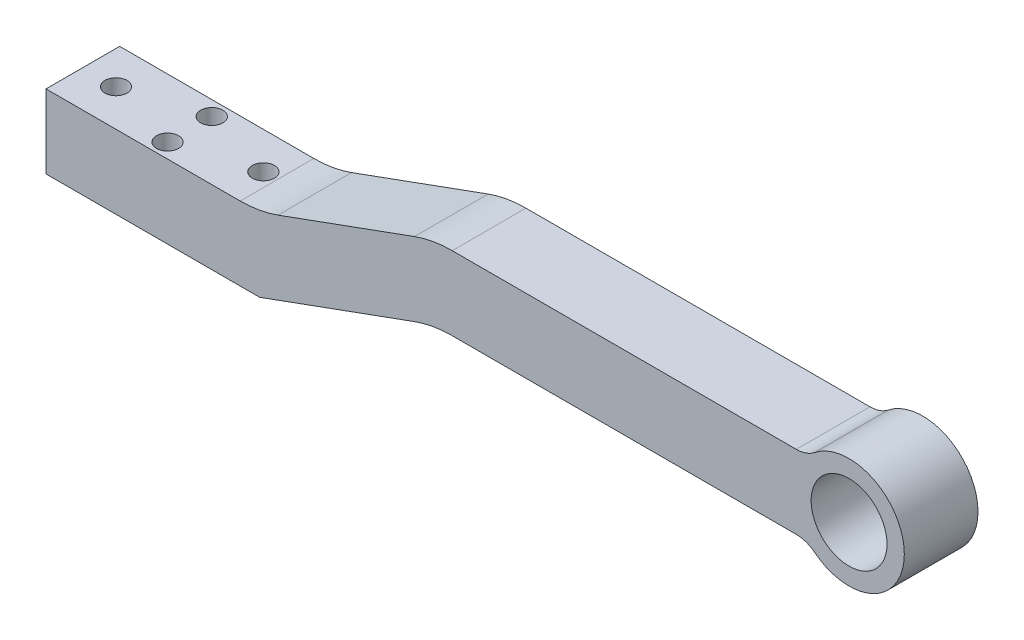
ISO-10303-21;
HEADER;
FILE_DESCRIPTION(('STEP AP214'),'2;1');
FILE_NAME('part.step','',(''),(''),'','','');
FILE_SCHEMA(('AUTOMOTIVE_DESIGN { 1 0 10303 214 1 1 1 1 }'));
ENDSEC;
DATA;
#1=APPLICATION_CONTEXT('core data for automotive mechanical design processes');
#2=APPLICATION_PROTOCOL_DEFINITION('international standard','automotive_design',2000,#1);
#3=PRODUCT_CONTEXT('',#1,'mechanical');
#4=PRODUCT('Part','Part','',(#3));
#5=PRODUCT_RELATED_PRODUCT_CATEGORY('part','',(#4));
#6=PRODUCT_DEFINITION_FORMATION('','',#4);
#7=PRODUCT_DEFINITION_CONTEXT('part definition',#1,'design');
#8=PRODUCT_DEFINITION('design','',#6,#7);
#9=PRODUCT_DEFINITION_SHAPE('','',#8);
#10=(LENGTH_UNIT() NAMED_UNIT(*) SI_UNIT(.MILLI.,.METRE.));
#11=(NAMED_UNIT(*) PLANE_ANGLE_UNIT() SI_UNIT($,.RADIAN.));
#12=(NAMED_UNIT(*) SI_UNIT($,.STERADIAN.) SOLID_ANGLE_UNIT());
#13=UNCERTAINTY_MEASURE_WITH_UNIT(LENGTH_MEASURE(1.E-05),#10,'distance_accuracy_value','');
#14=(GEOMETRIC_REPRESENTATION_CONTEXT(3) GLOBAL_UNCERTAINTY_ASSIGNED_CONTEXT((#13)) GLOBAL_UNIT_ASSIGNED_CONTEXT((#10,
#11,#12)) REPRESENTATION_CONTEXT('',''));
#15=CARTESIAN_POINT('',(0.,0.,0.));
#16=DIRECTION('',(0.,0.,1.));
#17=DIRECTION('',(1.,0.,0.));
#18=AXIS2_PLACEMENT_3D('',#15,#16,#17);
#19=CARTESIAN_POINT('',(154.228900421622,233.510087452104,4.));
#20=DIRECTION('',(0.,-1.,0.));
#21=DIRECTION('',(1.,0.,0.));
#22=AXIS2_PLACEMENT_3D('',#19,#20,#21);
#23=CYLINDRICAL_SURFACE('',#22,1.60000000000002);
#24=CARTESIAN_POINT('',(154.228900421622,213.510087452104,4.));
#25=DIRECTION('',(0.,-1.,0.));
#26=DIRECTION('',(1.,0.,0.));
#27=AXIS2_PLACEMENT_3D('',#24,#25,#26);
#28=CIRCLE('',#27,1.60000000000002);
#29=CARTESIAN_POINT('',(155.828900421622,213.510087452104,4.));
#30=VERTEX_POINT('',#29);
#31=EDGE_CURVE('E220',#30,#30,#28,.T.);
#32=ORIENTED_EDGE('',*,*,#31,.T.);
#33=EDGE_LOOP('',(#32));
#34=FACE_BOUND('',#33,.T.);
#35=CARTESIAN_POINT('',(154.228900421622,225.010087452104,4.));
#36=DIRECTION('',(0.,1.,0.));
#37=DIRECTION('',(0.,0.,1.));
#38=AXIS2_PLACEMENT_3D('',#35,#36,#37);
#39=CIRCLE('',#38,1.60000000000002);
#40=CARTESIAN_POINT('',(154.228900421622,225.010087452104,5.60000000000002));
#41=VERTEX_POINT('',#40);
#42=EDGE_CURVE('E39',#41,#41,#39,.F.);
#43=ORIENTED_EDGE('',*,*,#42,.F.);
#44=EDGE_LOOP('',(#43));
#45=FACE_BOUND('',#44,.T.);
#46=ADVANCED_FACE('F35',(#34,#45),#23,.F.);
#47=CARTESIAN_POINT('',(154.228900421622,233.510087452104,16.));
#48=DIRECTION('',(0.,-1.,0.));
#49=DIRECTION('',(1.,0.,0.));
#50=AXIS2_PLACEMENT_3D('',#47,#48,#49);
#51=CYLINDRICAL_SURFACE('',#50,1.59999999999999);
#52=CARTESIAN_POINT('',(154.228900421622,213.510087452104,16.));
#53=DIRECTION('',(0.,-1.,0.));
#54=DIRECTION('',(1.,0.,0.));
#55=AXIS2_PLACEMENT_3D('',#52,#53,#54);
#56=CIRCLE('',#55,1.59999999999999);
#57=CARTESIAN_POINT('',(155.828900421622,213.510087452104,16.));
#58=VERTEX_POINT('',#57);
#59=EDGE_CURVE('E245',#58,#58,#56,.T.);
#60=ORIENTED_EDGE('',*,*,#59,.T.);
#61=EDGE_LOOP('',(#60));
#62=FACE_BOUND('',#61,.T.);
#63=CARTESIAN_POINT('',(154.228900421622,225.010087452104,16.));
#64=DIRECTION('',(0.,1.,0.));
#65=DIRECTION('',(0.,0.,1.));
#66=AXIS2_PLACEMENT_3D('',#63,#64,#65);
#67=CIRCLE('',#66,1.59999999999999);
#68=CARTESIAN_POINT('',(154.228900421622,225.010087452104,17.6));
#69=VERTEX_POINT('',#68);
#70=EDGE_CURVE('E224',#69,#69,#67,.F.);
#71=ORIENTED_EDGE('',*,*,#70,.F.);
#72=EDGE_LOOP('',(#71));
#73=FACE_BOUND('',#72,.T.);
#74=ADVANCED_FACE('F304',(#62,#73),#51,.F.);
#75=CARTESIAN_POINT('',(174.228900421622,233.510087452104,10.));
#76=DIRECTION('',(0.,-1.,0.));
#77=DIRECTION('',(1.,0.,0.));
#78=AXIS2_PLACEMENT_3D('',#75,#76,#77);
#79=CYLINDRICAL_SURFACE('',#78,1.59999999999999);
#80=CARTESIAN_POINT('',(174.228900421622,213.510087452104,10.));
#81=DIRECTION('',(0.,-1.,0.));
#82=DIRECTION('',(1.,0.,0.));
#83=AXIS2_PLACEMENT_3D('',#80,#81,#82);
#84=CIRCLE('',#83,1.59999999999999);
#85=CARTESIAN_POINT('',(175.828900421622,213.510087452104,10.));
#86=VERTEX_POINT('',#85);
#87=EDGE_CURVE('E241',#86,#86,#84,.T.);
#88=ORIENTED_EDGE('',*,*,#87,.T.);
#89=EDGE_LOOP('',(#88));
#90=FACE_BOUND('',#89,.T.);
#91=CARTESIAN_POINT('',(174.228900421622,225.010087452104,10.));
#92=DIRECTION('',(0.,1.,0.));
#93=DIRECTION('',(0.,0.,1.));
#94=AXIS2_PLACEMENT_3D('',#91,#92,#93);
#95=CIRCLE('',#94,1.59999999999999);
#96=CARTESIAN_POINT('',(174.228900421622,225.010087452104,11.6));
#97=VERTEX_POINT('',#96);
#98=EDGE_CURVE('E222',#97,#97,#95,.F.);
#99=ORIENTED_EDGE('',*,*,#98,.F.);
#100=EDGE_LOOP('',(#99));
#101=FACE_BOUND('',#100,.T.);
#102=ADVANCED_FACE('F310',(#90,#101),#79,.F.);
#103=CARTESIAN_POINT('',(134.228900421622,233.510087452104,10.));
#104=DIRECTION('',(0.,-1.,0.));
#105=DIRECTION('',(1.,0.,0.));
#106=AXIS2_PLACEMENT_3D('',#103,#104,#105);
#107=CYLINDRICAL_SURFACE('',#106,1.59999999999999);
#108=CARTESIAN_POINT('',(134.228900421622,213.510087452104,10.));
#109=DIRECTION('',(0.,-1.,0.));
#110=DIRECTION('',(1.,0.,0.));
#111=AXIS2_PLACEMENT_3D('',#108,#109,#110);
#112=CIRCLE('',#111,1.59999999999999);
#113=CARTESIAN_POINT('',(135.828900421622,213.510087452104,10.));
#114=VERTEX_POINT('',#113);
#115=EDGE_CURVE('E244',#114,#114,#112,.T.);
#116=ORIENTED_EDGE('',*,*,#115,.T.);
#117=EDGE_LOOP('',(#116));
#118=FACE_BOUND('',#117,.T.);
#119=CARTESIAN_POINT('',(134.228900421622,225.010087452104,10.));
#120=DIRECTION('',(0.,1.,0.));
#121=DIRECTION('',(0.,0.,1.));
#122=AXIS2_PLACEMENT_3D('',#119,#120,#121);
#123=CIRCLE('',#122,1.59999999999999);
#124=CARTESIAN_POINT('',(134.228900421622,225.010087452104,11.6));
#125=VERTEX_POINT('',#124);
#126=EDGE_CURVE('E217',#125,#125,#123,.F.);
#127=ORIENTED_EDGE('',*,*,#126,.F.);
#128=EDGE_LOOP('',(#127));
#129=FACE_BOUND('',#128,.T.);
#130=ADVANCED_FACE('F316',(#118,#129),#107,.F.);
#131=CARTESIAN_POINT('',(328.909813265947,222.611094618387,20.));
#132=DIRECTION('',(0.,0.,1.));
#133=DIRECTION('',(1.,0.,0.));
#134=AXIS2_PLACEMENT_3D('',#131,#132,#133);
#135=PLANE('',#134);
#136=CARTESIAN_POINT('',(328.909813265947,222.611094618387,20.));
#137=DIRECTION('',(0.,0.,-1.));
#138=DIRECTION('',(1.,0.,0.));
#139=AXIS2_PLACEMENT_3D('',#136,#137,#138);
#140=CIRCLE('',#139,8.00000000000002);
#141=CARTESIAN_POINT('',(328.909813265947,230.611094618387,20.));
#142=VERTEX_POINT('',#141);
#143=CARTESIAN_POINT('',(333.890365320094,228.871613864897,20.));
#144=VERTEX_POINT('',#143);
#145=EDGE_CURVE('E190',#142,#144,#140,.T.);
#146=ORIENTED_EDGE('',*,*,#145,.T.);
#147=CARTESIAN_POINT('',(343.228900421622,240.610087452104,20.));
#148=DIRECTION('',(0.,0.,1.));
#149=DIRECTION('',(1.,0.,0.));
#150=AXIS2_PLACEMENT_3D('',#147,#148,#149);
#151=CIRCLE('',#150,15.);
#152=CARTESIAN_POINT('',(333.891295648932,252.349301101622,20.));
#153=VERTEX_POINT('',#152);
#154=EDGE_CURVE('E112',#144,#153,#151,.T.);
#155=ORIENTED_EDGE('',*,*,#154,.T.);
#156=CARTESIAN_POINT('',(328.911239770165,258.610215048032,20.));
#157=DIRECTION('',(0.,0.,-1.));
#158=DIRECTION('',(1.,0.,0.));
#159=AXIS2_PLACEMENT_3D('',#156,#157,#158);
#160=CIRCLE('',#159,7.99999999999999);
#161=CARTESIAN_POINT('',(328.911168476054,250.61021504835,20.));
#162=VERTEX_POINT('',#161);
#163=EDGE_CURVE('E259',#153,#162,#160,.T.);
#164=ORIENTED_EDGE('',*,*,#163,.T.);
#165=DIRECTION('',(-0.99999999996029,8.91176388371409E-06,0.));
#166=VECTOR('',#165,1.);
#167=CARTESIAN_POINT('',(235.50347871469,250.611047475626,20.));
#168=LINE('',#167,#166);
#169=CARTESIAN_POINT('',(235.50347871469,250.611047475626,20.));
#170=VERTEX_POINT('',#169);
#171=EDGE_CURVE('E261',#162,#170,#168,.T.);
#172=ORIENTED_EDGE('',*,*,#171,.T.);
#173=CARTESIAN_POINT('',(235.503211361773,220.611047476817,20.));
#174=DIRECTION('',(0.,0.,1.));
#175=DIRECTION('',(1.,0.,0.));
#176=AXIS2_PLACEMENT_3D('',#173,#174,#175);
#177=CIRCLE('',#176,30.);
#178=CARTESIAN_POINT('',(225.242607062003,248.801826100395,20.));
#179=VERTEX_POINT('',#178);
#180=EDGE_CURVE('E263',#170,#179,#177,.T.);
#181=ORIENTED_EDGE('',*,*,#180,.T.);
#182=DIRECTION('',(-0.939692620785908,-0.342020143325669,0.));
#183=VECTOR('',#182,1.);
#184=CARTESIAN_POINT('',(188.199695300138,235.319308828526,20.));
#185=LINE('',#184,#183);
#186=CARTESIAN_POINT('',(188.199695300138,235.319308828526,20.));
#187=VERTEX_POINT('',#186);
#188=EDGE_CURVE('E265',#179,#187,#185,.T.);
#189=ORIENTED_EDGE('',*,*,#188,.T.);
#190=CARTESIAN_POINT('',(177.939091000368,263.510087452104,20.));
#191=DIRECTION('',(0.,0.,-1.));
#192=DIRECTION('',(1.,0.,0.));
#193=AXIS2_PLACEMENT_3D('',#190,#191,#192);
#194=CIRCLE('',#193,30.);
#195=CARTESIAN_POINT('',(177.939091000368,233.510087452104,20.));
#196=VERTEX_POINT('',#195);
#197=EDGE_CURVE('E267',#187,#196,#194,.T.);
#198=ORIENTED_EDGE('',*,*,#197,.T.);
#199=DIRECTION('',(-1.,0.,0.));
#200=VECTOR('',#199,1.);
#201=CARTESIAN_POINT('',(125.228900421622,233.510087452104,20.));
#202=LINE('',#201,#200);
#203=CARTESIAN_POINT('',(125.228900421622,233.510087452104,20.));
#204=VERTEX_POINT('',#203);
#205=EDGE_CURVE('E269',#196,#204,#202,.T.);
#206=ORIENTED_EDGE('',*,*,#205,.T.);
#207=DIRECTION('',(0.,-1.,0.));
#208=VECTOR('',#207,1.);
#209=CARTESIAN_POINT('',(125.228900421622,233.510087452104,20.));
#210=LINE('',#209,#208);
#211=CARTESIAN_POINT('',(125.228900421622,213.510087452104,20.));
#212=VERTEX_POINT('',#211);
#213=EDGE_CURVE('E271',#204,#212,#210,.T.);
#214=ORIENTED_EDGE('',*,*,#213,.T.);
#215=DIRECTION('',(1.,0.,0.));
#216=VECTOR('',#215,1.);
#217=CARTESIAN_POINT('',(125.228900421622,213.510087452104,20.));
#218=LINE('',#217,#216);
#219=CARTESIAN_POINT('',(183.228900421622,213.510087452104,20.));
#220=VERTEX_POINT('',#219);
#221=EDGE_CURVE('E147',#212,#220,#218,.T.);
#222=ORIENTED_EDGE('',*,*,#221,.T.);
#223=DIRECTION('',(0.939692620785909,0.342020143325669,0.));
#224=VECTOR('',#223,1.);
#225=CARTESIAN_POINT('',(183.228900421622,213.510087452104,20.));
#226=LINE('',#225,#224);
#227=CARTESIAN_POINT('',(225.242736582401,228.801873241964,20.));
#228=VERTEX_POINT('',#227);
#229=EDGE_CURVE('E140',#220,#228,#226,.T.);
#230=ORIENTED_EDGE('',*,*,#229,.T.);
#231=CARTESIAN_POINT('',(235.503340882171,200.611094618387,20.));
#232=DIRECTION('',(0.,0.,-1.));
#233=DIRECTION('',(1.,0.,0.));
#234=AXIS2_PLACEMENT_3D('',#231,#232,#233);
#235=CIRCLE('',#234,30.);
#236=CARTESIAN_POINT('',(235.503340882171,230.611094618387,20.));
#237=VERTEX_POINT('',#236);
#238=EDGE_CURVE('E145',#228,#237,#235,.T.);
#239=ORIENTED_EDGE('',*,*,#238,.T.);
#240=DIRECTION('',(1.,0.,0.));
#241=VECTOR('',#240,1.);
#242=CARTESIAN_POINT('',(235.503340882171,230.611094618387,20.));
#243=LINE('',#242,#241);
#244=EDGE_CURVE('E54',#237,#142,#243,.T.);
#245=ORIENTED_EDGE('',*,*,#244,.T.);
#246=EDGE_LOOP('',(#146,#155,#164,#172,#181,#189,#198,#206,#214,#222,#230,#239,#245));
#247=FACE_BOUND('',#246,.T.);
#248=CARTESIAN_POINT('',(343.228900421622,240.610087452104,20.));
#249=DIRECTION('',(0.,0.,1.));
#250=DIRECTION('',(1.,0.,0.));
#251=AXIS2_PLACEMENT_3D('',#248,#249,#250);
#252=CIRCLE('',#251,10.3);
#253=CARTESIAN_POINT('',(353.528900421622,240.610087452104,20.));
#254=VERTEX_POINT('',#253);
#255=EDGE_CURVE('E169',#254,#254,#252,.T.);
#256=ORIENTED_EDGE('',*,*,#255,.F.);
#257=EDGE_LOOP('',(#256));
#258=FACE_BOUND('',#257,.T.);
#259=ADVANCED_FACE('F142',(#247,#258),#135,.T.);
#260=CARTESIAN_POINT('',(328.909813265947,222.611094618387,0.));
#261=DIRECTION('',(0.,0.,1.));
#262=DIRECTION('',(1.,0.,0.));
#263=AXIS2_PLACEMENT_3D('',#260,#261,#262);
#264=PLANE('',#263);
#265=CARTESIAN_POINT('',(328.909813265947,222.611094618387,0.));
#266=DIRECTION('',(0.,0.,-1.));
#267=DIRECTION('',(1.,0.,0.));
#268=AXIS2_PLACEMENT_3D('',#265,#266,#267);
#269=CIRCLE('',#268,8.00000000000002);
#270=CARTESIAN_POINT('',(328.909813265947,230.611094618387,0.));
#271=VERTEX_POINT('',#270);
#272=CARTESIAN_POINT('',(333.890365320094,228.871613864897,0.));
#273=VERTEX_POINT('',#272);
#274=EDGE_CURVE('E165',#271,#273,#269,.T.);
#275=ORIENTED_EDGE('',*,*,#274,.F.);
#276=DIRECTION('',(1.,0.,0.));
#277=VECTOR('',#276,1.);
#278=CARTESIAN_POINT('',(235.503340882171,230.611094618387,0.));
#279=LINE('',#278,#277);
#280=CARTESIAN_POINT('',(235.503340882171,230.611094618387,0.));
#281=VERTEX_POINT('',#280);
#282=EDGE_CURVE('E104',#281,#271,#279,.T.);
#283=ORIENTED_EDGE('',*,*,#282,.F.);
#284=CARTESIAN_POINT('',(235.503340882171,200.611094618387,0.));
#285=DIRECTION('',(0.,0.,-1.));
#286=DIRECTION('',(1.,0.,0.));
#287=AXIS2_PLACEMENT_3D('',#284,#285,#286);
#288=CIRCLE('',#287,30.);
#289=CARTESIAN_POINT('',(225.242736582401,228.801873241964,0.));
#290=VERTEX_POINT('',#289);
#291=EDGE_CURVE('E98',#290,#281,#288,.T.);
#292=ORIENTED_EDGE('',*,*,#291,.F.);
#293=DIRECTION('',(0.939692620785909,0.342020143325669,0.));
#294=VECTOR('',#293,1.);
#295=CARTESIAN_POINT('',(183.228900421622,213.510087452104,0.));
#296=LINE('',#295,#294);
#297=CARTESIAN_POINT('',(183.228900421622,213.510087452104,0.));
#298=VERTEX_POINT('',#297);
#299=EDGE_CURVE('E155',#298,#290,#296,.T.);
#300=ORIENTED_EDGE('',*,*,#299,.F.);
#301=DIRECTION('',(1.,0.,0.));
#302=VECTOR('',#301,1.);
#303=CARTESIAN_POINT('',(125.228900421622,213.510087452104,0.));
#304=LINE('',#303,#302);
#305=CARTESIAN_POINT('',(125.228900421622,213.510087452104,0.));
#306=VERTEX_POINT('',#305);
#307=EDGE_CURVE('E185',#306,#298,#304,.T.);
#308=ORIENTED_EDGE('',*,*,#307,.F.);
#309=DIRECTION('',(0.,-1.,0.));
#310=VECTOR('',#309,1.);
#311=CARTESIAN_POINT('',(125.228900421622,233.510087452104,0.));
#312=LINE('',#311,#310);
#313=CARTESIAN_POINT('',(125.228900421622,233.510087452104,0.));
#314=VERTEX_POINT('',#313);
#315=EDGE_CURVE('E183',#314,#306,#312,.T.);
#316=ORIENTED_EDGE('',*,*,#315,.F.);
#317=DIRECTION('',(-1.,0.,0.));
#318=VECTOR('',#317,1.);
#319=CARTESIAN_POINT('',(125.228900421622,233.510087452104,0.));
#320=LINE('',#319,#318);
#321=CARTESIAN_POINT('',(177.939091000368,233.510087452104,0.));
#322=VERTEX_POINT('',#321);
#323=EDGE_CURVE('E181',#322,#314,#320,.T.);
#324=ORIENTED_EDGE('',*,*,#323,.F.);
#325=CARTESIAN_POINT('',(177.939091000368,263.510087452104,0.));
#326=DIRECTION('',(0.,0.,-1.));
#327=DIRECTION('',(1.,0.,0.));
#328=AXIS2_PLACEMENT_3D('',#325,#326,#327);
#329=CIRCLE('',#328,30.);
#330=CARTESIAN_POINT('',(188.199695300138,235.319308828526,0.));
#331=VERTEX_POINT('',#330);
#332=EDGE_CURVE('E179',#331,#322,#329,.T.);
#333=ORIENTED_EDGE('',*,*,#332,.F.);
#334=DIRECTION('',(-0.939692620785908,-0.342020143325669,0.));
#335=VECTOR('',#334,1.);
#336=CARTESIAN_POINT('',(188.199695300138,235.319308828526,0.));
#337=LINE('',#336,#335);
#338=CARTESIAN_POINT('',(225.242607062003,248.801826100395,0.));
#339=VERTEX_POINT('',#338);
#340=EDGE_CURVE('E177',#339,#331,#337,.T.);
#341=ORIENTED_EDGE('',*,*,#340,.F.);
#342=CARTESIAN_POINT('',(235.503211361773,220.611047476817,0.));
#343=DIRECTION('',(0.,0.,1.));
#344=DIRECTION('',(1.,0.,0.));
#345=AXIS2_PLACEMENT_3D('',#342,#343,#344);
#346=CIRCLE('',#345,30.);
#347=CARTESIAN_POINT('',(235.50347871469,250.611047475626,0.));
#348=VERTEX_POINT('',#347);
#349=EDGE_CURVE('E175',#348,#339,#346,.T.);
#350=ORIENTED_EDGE('',*,*,#349,.F.);
#351=DIRECTION('',(-0.99999999996029,8.91176388371409E-06,0.));
#352=VECTOR('',#351,1.);
#353=CARTESIAN_POINT('',(235.50347871469,250.611047475626,0.));
#354=LINE('',#353,#352);
#355=CARTESIAN_POINT('',(328.911168476054,250.61021504835,0.));
#356=VERTEX_POINT('',#355);
#357=EDGE_CURVE('E173',#356,#348,#354,.T.);
#358=ORIENTED_EDGE('',*,*,#357,.F.);
#359=CARTESIAN_POINT('',(328.911239770165,258.610215048032,0.));
#360=DIRECTION('',(0.,0.,-1.));
#361=DIRECTION('',(1.,0.,0.));
#362=AXIS2_PLACEMENT_3D('',#359,#360,#361);
#363=CIRCLE('',#362,7.99999999999999);
#364=CARTESIAN_POINT('',(333.891295648932,252.349301101622,0.));
#365=VERTEX_POINT('',#364);
#366=EDGE_CURVE('E171',#365,#356,#363,.T.);
#367=ORIENTED_EDGE('',*,*,#366,.F.);
#368=CARTESIAN_POINT('',(343.228900421622,240.610087452104,0.));
#369=DIRECTION('',(0.,0.,1.));
#370=DIRECTION('',(1.,0.,0.));
#371=AXIS2_PLACEMENT_3D('',#368,#369,#370);
#372=CIRCLE('',#371,15.);
#373=EDGE_CURVE('E168',#273,#365,#372,.T.);
#374=ORIENTED_EDGE('',*,*,#373,.F.);
#375=EDGE_LOOP('',(#275,#283,#292,#300,#308,#316,#324,#333,#341,#350,#358,#367,#374));
#376=FACE_BOUND('',#375,.T.);
#377=CARTESIAN_POINT('',(343.228900421622,240.610087452104,0.));
#378=DIRECTION('',(0.,0.,1.));
#379=DIRECTION('',(1.,0.,0.));
#380=AXIS2_PLACEMENT_3D('',#377,#378,#379);
#381=CIRCLE('',#380,10.3);
#382=CARTESIAN_POINT('',(353.528900421622,240.610087452104,0.));
#383=VERTEX_POINT('',#382);
#384=EDGE_CURVE('E252',#383,#383,#381,.T.);
#385=ORIENTED_EDGE('',*,*,#384,.T.);
#386=EDGE_LOOP('',(#385));
#387=FACE_BOUND('',#386,.T.);
#388=ADVANCED_FACE('F284',(#376,#387),#264,.F.);
#389=CARTESIAN_POINT('',(328.909813265947,222.611094618387,20.));
#390=DIRECTION('',(0.,0.,-1.));
#391=DIRECTION('',(-1.,0.,0.));
#392=AXIS2_PLACEMENT_3D('',#389,#390,#391);
#393=CYLINDRICAL_SURFACE('',#392,8.00000000000002);
#394=ORIENTED_EDGE('',*,*,#274,.T.);
#395=DIRECTION('',(0.,0.,-1.));
#396=VECTOR('',#395,1.);
#397=CARTESIAN_POINT('',(333.890365320094,228.871613864897,20.));
#398=LINE('',#397,#396);
#399=EDGE_CURVE('E11',#144,#273,#398,.T.);
#400=ORIENTED_EDGE('',*,*,#399,.F.);
#401=ORIENTED_EDGE('',*,*,#145,.F.);
#402=DIRECTION('',(0.,0.,-1.));
#403=VECTOR('',#402,1.);
#404=CARTESIAN_POINT('',(328.909813265947,230.611094618387,20.));
#405=LINE('',#404,#403);
#406=EDGE_CURVE('E161',#142,#271,#405,.T.);
#407=ORIENTED_EDGE('',*,*,#406,.T.);
#408=EDGE_LOOP('',(#394,#400,#401,#407));
#409=FACE_BOUND('',#408,.T.);
#410=ADVANCED_FACE('F37',(#409),#393,.F.);
#411=CARTESIAN_POINT('',(343.228900421622,240.610087452104,20.));
#412=DIRECTION('',(0.,0.,-1.));
#413=DIRECTION('',(-1.,0.,0.));
#414=AXIS2_PLACEMENT_3D('',#411,#412,#413);
#415=CYLINDRICAL_SURFACE('',#414,15.);
#416=ORIENTED_EDGE('',*,*,#373,.T.);
#417=DIRECTION('',(0.,0.,-1.));
#418=VECTOR('',#417,1.);
#419=CARTESIAN_POINT('',(333.891295648932,252.349301101622,20.));
#420=LINE('',#419,#418);
#421=EDGE_CURVE('E45',#153,#365,#420,.T.);
#422=ORIENTED_EDGE('',*,*,#421,.F.);
#423=ORIENTED_EDGE('',*,*,#154,.F.);
#424=ORIENTED_EDGE('',*,*,#399,.T.);
#425=EDGE_LOOP('',(#416,#422,#423,#424));
#426=FACE_BOUND('',#425,.T.);
#427=ADVANCED_FACE('F325',(#426),#415,.T.);
#428=CARTESIAN_POINT('',(328.911239770165,258.610215048032,20.));
#429=DIRECTION('',(0.,0.,-1.));
#430=DIRECTION('',(-1.,0.,0.));
#431=AXIS2_PLACEMENT_3D('',#428,#429,#430);
#432=CYLINDRICAL_SURFACE('',#431,7.99999999999999);
#433=ORIENTED_EDGE('',*,*,#366,.T.);
#434=DIRECTION('',(0.,0.,-1.));
#435=VECTOR('',#434,1.);
#436=CARTESIAN_POINT('',(328.911168476054,250.61021504835,20.));
#437=LINE('',#436,#435);
#438=EDGE_CURVE('E212',#162,#356,#437,.T.);
#439=ORIENTED_EDGE('',*,*,#438,.F.);
#440=ORIENTED_EDGE('',*,*,#163,.F.);
#441=ORIENTED_EDGE('',*,*,#421,.T.);
#442=EDGE_LOOP('',(#433,#439,#440,#441));
#443=FACE_BOUND('',#442,.T.);
#444=ADVANCED_FACE('F329',(#443),#432,.F.);
#445=CARTESIAN_POINT('',(235.50347871469,250.611047475626,20.));
#446=DIRECTION('',(-8.91176388371409E-06,-0.99999999996029,0.));
#447=DIRECTION('',(0.99999999996029,-8.91176388371409E-06,0.));
#448=AXIS2_PLACEMENT_3D('',#445,#446,#447);
#449=PLANE('',#448);
#450=ORIENTED_EDGE('',*,*,#357,.T.);
#451=DIRECTION('',(0.,0.,-1.));
#452=VECTOR('',#451,1.);
#453=CARTESIAN_POINT('',(235.50347871469,250.611047475626,20.));
#454=LINE('',#453,#452);
#455=EDGE_CURVE('E209',#170,#348,#454,.T.);
#456=ORIENTED_EDGE('',*,*,#455,.F.);
#457=ORIENTED_EDGE('',*,*,#171,.F.);
#458=ORIENTED_EDGE('',*,*,#438,.T.);
#459=EDGE_LOOP('',(#450,#456,#457,#458));
#460=FACE_BOUND('',#459,.T.);
#461=ADVANCED_FACE('F333',(#460),#449,.F.);
#462=CARTESIAN_POINT('',(235.503211361773,220.611047476817,20.));
#463=DIRECTION('',(0.,0.,-1.));
#464=DIRECTION('',(-1.,0.,0.));
#465=AXIS2_PLACEMENT_3D('',#462,#463,#464);
#466=CYLINDRICAL_SURFACE('',#465,30.);
#467=ORIENTED_EDGE('',*,*,#349,.T.);
#468=DIRECTION('',(0.,0.,-1.));
#469=VECTOR('',#468,1.);
#470=CARTESIAN_POINT('',(225.242607062003,248.801826100395,20.));
#471=LINE('',#470,#469);
#472=EDGE_CURVE('E206',#179,#339,#471,.T.);
#473=ORIENTED_EDGE('',*,*,#472,.F.);
#474=ORIENTED_EDGE('',*,*,#180,.F.);
#475=ORIENTED_EDGE('',*,*,#455,.T.);
#476=EDGE_LOOP('',(#467,#473,#474,#475));
#477=FACE_BOUND('',#476,.T.);
#478=ADVANCED_FACE('F339',(#477),#466,.T.);
#479=CARTESIAN_POINT('',(188.199695300138,235.319308828526,20.));
#480=DIRECTION('',(0.342020143325669,-0.939692620785908,0.));
#481=DIRECTION('',(0.939692620785908,0.342020143325669,0.));
#482=AXIS2_PLACEMENT_3D('',#479,#480,#481);
#483=PLANE('',#482);
#484=ORIENTED_EDGE('',*,*,#340,.T.);
#485=DIRECTION('',(0.,0.,-1.));
#486=VECTOR('',#485,1.);
#487=CARTESIAN_POINT('',(188.199695300138,235.319308828526,20.));
#488=LINE('',#487,#486);
#489=EDGE_CURVE('E203',#187,#331,#488,.T.);
#490=ORIENTED_EDGE('',*,*,#489,.F.);
#491=ORIENTED_EDGE('',*,*,#188,.F.);
#492=ORIENTED_EDGE('',*,*,#472,.T.);
#493=EDGE_LOOP('',(#484,#490,#491,#492));
#494=FACE_BOUND('',#493,.T.);
#495=ADVANCED_FACE('F343',(#494),#483,.F.);
#496=CARTESIAN_POINT('',(177.939091000368,263.510087452104,20.));
#497=DIRECTION('',(0.,0.,-1.));
#498=DIRECTION('',(-1.,0.,0.));
#499=AXIS2_PLACEMENT_3D('',#496,#497,#498);
#500=CYLINDRICAL_SURFACE('',#499,30.);
#501=ORIENTED_EDGE('',*,*,#332,.T.);
#502=DIRECTION('',(0.,0.,-1.));
#503=VECTOR('',#502,1.);
#504=CARTESIAN_POINT('',(177.939091000368,233.510087452104,20.));
#505=LINE('',#504,#503);
#506=EDGE_CURVE('E200',#196,#322,#505,.T.);
#507=ORIENTED_EDGE('',*,*,#506,.F.);
#508=ORIENTED_EDGE('',*,*,#197,.F.);
#509=ORIENTED_EDGE('',*,*,#489,.T.);
#510=EDGE_LOOP('',(#501,#507,#508,#509));
#511=FACE_BOUND('',#510,.T.);
#512=ADVANCED_FACE('F347',(#511),#500,.F.);
#513=CARTESIAN_POINT('',(125.228900421622,233.510087452104,20.));
#514=DIRECTION('',(0.,-1.,0.));
#515=DIRECTION('',(0.,0.,-1.));
#516=AXIS2_PLACEMENT_3D('',#513,#514,#515);
#517=PLANE('',#516);
#518=CARTESIAN_POINT('',(174.228900421622,233.510087452104,10.));
#519=DIRECTION('',(0.,1.,0.));
#520=DIRECTION('',(0.,0.,1.));
#521=AXIS2_PLACEMENT_3D('',#518,#519,#520);
#522=CIRCLE('',#521,3.00000000000002);
#523=CARTESIAN_POINT('',(174.228900421622,233.510087452104,13.));
#524=VERTEX_POINT('',#523);
#525=EDGE_CURVE('E513',#524,#524,#522,.T.);
#526=ORIENTED_EDGE('',*,*,#525,.F.);
#527=EDGE_LOOP('',(#526));
#528=FACE_BOUND('',#527,.T.);
#529=CARTESIAN_POINT('',(154.228900421622,233.510087452104,16.));
#530=DIRECTION('',(0.,1.,0.));
#531=DIRECTION('',(0.,0.,1.));
#532=AXIS2_PLACEMENT_3D('',#529,#530,#531);
#533=CIRCLE('',#532,3.00000000000002);
#534=CARTESIAN_POINT('',(154.228900421622,233.510087452104,19.));
#535=VERTEX_POINT('',#534);
#536=EDGE_CURVE('E510',#535,#535,#533,.T.);
#537=ORIENTED_EDGE('',*,*,#536,.F.);
#538=EDGE_LOOP('',(#537));
#539=FACE_BOUND('',#538,.T.);
#540=CARTESIAN_POINT('',(154.228900421622,233.510087452104,4.));
#541=DIRECTION('',(0.,1.,0.));
#542=DIRECTION('',(0.,0.,1.));
#543=AXIS2_PLACEMENT_3D('',#540,#541,#542);
#544=CIRCLE('',#543,2.99999999999999);
#545=CARTESIAN_POINT('',(154.228900421622,233.510087452104,6.99999999999999));
#546=VERTEX_POINT('',#545);
#547=EDGE_CURVE('E505',#546,#546,#544,.T.);
#548=ORIENTED_EDGE('',*,*,#547,.F.);
#549=EDGE_LOOP('',(#548));
#550=FACE_BOUND('',#549,.T.);
#551=CARTESIAN_POINT('',(134.228900421622,233.510087452104,10.));
#552=DIRECTION('',(0.,1.,0.));
#553=DIRECTION('',(0.,0.,1.));
#554=AXIS2_PLACEMENT_3D('',#551,#552,#553);
#555=CIRCLE('',#554,3.00000000000002);
#556=CARTESIAN_POINT('',(134.228900421622,233.510087452104,13.));
#557=VERTEX_POINT('',#556);
#558=EDGE_CURVE('E230',#557,#557,#555,.T.);
#559=ORIENTED_EDGE('',*,*,#558,.F.);
#560=EDGE_LOOP('',(#559));
#561=FACE_BOUND('',#560,.T.);
#562=ORIENTED_EDGE('',*,*,#323,.T.);
#563=DIRECTION('',(0.,0.,-1.));
#564=VECTOR('',#563,1.);
#565=CARTESIAN_POINT('',(125.228900421622,233.510087452104,20.));
#566=LINE('',#565,#564);
#567=EDGE_CURVE('E197',#204,#314,#566,.T.);
#568=ORIENTED_EDGE('',*,*,#567,.F.);
#569=ORIENTED_EDGE('',*,*,#205,.F.);
#570=ORIENTED_EDGE('',*,*,#506,.T.);
#571=EDGE_LOOP('',(#562,#568,#569,#570));
#572=FACE_BOUND('',#571,.T.);
#573=ADVANCED_FACE('F351',(#528,#539,#550,#561,#572),#517,.F.);
#574=CARTESIAN_POINT('',(125.228900421622,233.510087452104,20.));
#575=DIRECTION('',(1.,0.,0.));
#576=DIRECTION('',(0.,0.,-1.));
#577=AXIS2_PLACEMENT_3D('',#574,#575,#576);
#578=PLANE('',#577);
#579=ORIENTED_EDGE('',*,*,#315,.T.);
#580=DIRECTION('',(0.,0.,-1.));
#581=VECTOR('',#580,1.);
#582=CARTESIAN_POINT('',(125.228900421622,213.510087452104,20.));
#583=LINE('',#582,#581);
#584=EDGE_CURVE('E194',#212,#306,#583,.T.);
#585=ORIENTED_EDGE('',*,*,#584,.F.);
#586=ORIENTED_EDGE('',*,*,#213,.F.);
#587=ORIENTED_EDGE('',*,*,#567,.T.);
#588=EDGE_LOOP('',(#579,#585,#586,#587));
#589=FACE_BOUND('',#588,.T.);
#590=ADVANCED_FACE('F277',(#589),#578,.F.);
#591=CARTESIAN_POINT('',(125.228900421622,213.510087452104,20.));
#592=DIRECTION('',(0.,1.,0.));
#593=DIRECTION('',(-1.,0.,0.));
#594=AXIS2_PLACEMENT_3D('',#591,#592,#593);
#595=PLANE('',#594);
#596=ORIENTED_EDGE('',*,*,#87,.F.);
#597=EDGE_LOOP('',(#596));
#598=FACE_BOUND('',#597,.T.);
#599=ORIENTED_EDGE('',*,*,#59,.F.);
#600=EDGE_LOOP('',(#599));
#601=FACE_BOUND('',#600,.T.);
#602=ORIENTED_EDGE('',*,*,#31,.F.);
#603=EDGE_LOOP('',(#602));
#604=FACE_BOUND('',#603,.T.);
#605=ORIENTED_EDGE('',*,*,#115,.F.);
#606=EDGE_LOOP('',(#605));
#607=FACE_BOUND('',#606,.T.);
#608=ORIENTED_EDGE('',*,*,#307,.T.);
#609=DIRECTION('',(0.,0.,-1.));
#610=VECTOR('',#609,1.);
#611=CARTESIAN_POINT('',(183.228900421622,213.510087452104,20.));
#612=LINE('',#611,#610);
#613=EDGE_CURVE('E156',#220,#298,#612,.T.);
#614=ORIENTED_EDGE('',*,*,#613,.F.);
#615=ORIENTED_EDGE('',*,*,#221,.F.);
#616=ORIENTED_EDGE('',*,*,#584,.T.);
#617=EDGE_LOOP('',(#608,#614,#615,#616));
#618=FACE_BOUND('',#617,.T.);
#619=ADVANCED_FACE('F281',(#598,#601,#604,#607,#618),#595,.F.);
#620=CARTESIAN_POINT('',(183.228900421622,213.510087452104,20.));
#621=DIRECTION('',(-0.342020143325669,0.939692620785909,0.));
#622=DIRECTION('',(-0.939692620785909,-0.342020143325669,0.));
#623=AXIS2_PLACEMENT_3D('',#620,#621,#622);
#624=PLANE('',#623);
#625=ORIENTED_EDGE('',*,*,#299,.T.);
#626=DIRECTION('',(0.,0.,-1.));
#627=VECTOR('',#626,1.);
#628=CARTESIAN_POINT('',(225.242736582401,228.801873241964,20.));
#629=LINE('',#628,#627);
#630=EDGE_CURVE('E152',#228,#290,#629,.T.);
#631=ORIENTED_EDGE('',*,*,#630,.F.);
#632=ORIENTED_EDGE('',*,*,#229,.F.);
#633=ORIENTED_EDGE('',*,*,#613,.T.);
#634=EDGE_LOOP('',(#625,#631,#632,#633));
#635=FACE_BOUND('',#634,.T.);
#636=ADVANCED_FACE('F153',(#635),#624,.F.);
#637=CARTESIAN_POINT('',(235.503340882171,200.611094618387,20.));
#638=DIRECTION('',(0.,0.,-1.));
#639=DIRECTION('',(-1.,0.,0.));
#640=AXIS2_PLACEMENT_3D('',#637,#638,#639);
#641=CYLINDRICAL_SURFACE('',#640,30.);
#642=ORIENTED_EDGE('',*,*,#291,.T.);
#643=DIRECTION('',(0.,0.,-1.));
#644=VECTOR('',#643,1.);
#645=CARTESIAN_POINT('',(235.503340882171,230.611094618387,20.));
#646=LINE('',#645,#644);
#647=EDGE_CURVE('E157',#237,#281,#646,.T.);
#648=ORIENTED_EDGE('',*,*,#647,.F.);
#649=ORIENTED_EDGE('',*,*,#238,.F.);
#650=ORIENTED_EDGE('',*,*,#630,.T.);
#651=EDGE_LOOP('',(#642,#648,#649,#650));
#652=FACE_BOUND('',#651,.T.);
#653=ADVANCED_FACE('F159',(#652),#641,.F.);
#654=CARTESIAN_POINT('',(235.503340882171,230.611094618387,20.));
#655=DIRECTION('',(0.,1.,0.));
#656=DIRECTION('',(0.,0.,1.));
#657=AXIS2_PLACEMENT_3D('',#654,#655,#656);
#658=PLANE('',#657);
#659=ORIENTED_EDGE('',*,*,#282,.T.);
#660=ORIENTED_EDGE('',*,*,#406,.F.);
#661=ORIENTED_EDGE('',*,*,#244,.F.);
#662=ORIENTED_EDGE('',*,*,#647,.T.);
#663=EDGE_LOOP('',(#659,#660,#661,#662));
#664=FACE_BOUND('',#663,.T.);
#665=ADVANCED_FACE('F290',(#664),#658,.F.);
#666=CARTESIAN_POINT('',(343.228900421622,240.610087452104,20.));
#667=DIRECTION('',(0.,0.,-1.));
#668=DIRECTION('',(-1.,0.,0.));
#669=AXIS2_PLACEMENT_3D('',#666,#667,#668);
#670=CYLINDRICAL_SURFACE('',#669,10.3);
#671=ORIENTED_EDGE('',*,*,#255,.T.);
#672=EDGE_LOOP('',(#671));
#673=FACE_BOUND('',#672,.T.);
#674=ORIENTED_EDGE('',*,*,#384,.F.);
#675=EDGE_LOOP('',(#674));
#676=FACE_BOUND('',#675,.T.);
#677=ADVANCED_FACE('F292',(#673,#676),#670,.F.);
#678=CARTESIAN_POINT('',(134.228900421622,225.010087452104,10.));
#679=DIRECTION('',(0.,1.,0.));
#680=DIRECTION('',(0.,0.,1.));
#681=AXIS2_PLACEMENT_3D('',#678,#679,#680);
#682=PLANE('',#681);
#683=CARTESIAN_POINT('',(134.228900421622,225.010087452104,10.));
#684=DIRECTION('',(0.,1.,0.));
#685=DIRECTION('',(0.,0.,1.));
#686=AXIS2_PLACEMENT_3D('',#683,#684,#685);
#687=CIRCLE('',#686,3.00000000000002);
#688=CARTESIAN_POINT('',(134.228900421622,225.010087452104,13.));
#689=VERTEX_POINT('',#688);
#690=EDGE_CURVE('E221',#689,#689,#687,.T.);
#691=ORIENTED_EDGE('',*,*,#690,.T.);
#692=EDGE_LOOP('',(#691));
#693=FACE_BOUND('',#692,.T.);
#694=ORIENTED_EDGE('',*,*,#126,.T.);
#695=EDGE_LOOP('',(#694));
#696=FACE_BOUND('',#695,.T.);
#697=ADVANCED_FACE('F298',(#693,#696),#682,.T.);
#698=CARTESIAN_POINT('',(134.228900421622,225.010087452104,10.));
#699=DIRECTION('',(0.,1.,0.));
#700=DIRECTION('',(0.,0.,1.));
#701=AXIS2_PLACEMENT_3D('',#698,#699,#700);
#702=CYLINDRICAL_SURFACE('',#701,3.00000000000002);
#703=ORIENTED_EDGE('',*,*,#690,.F.);
#704=EDGE_LOOP('',(#703));
#705=FACE_BOUND('',#704,.T.);
#706=ORIENTED_EDGE('',*,*,#558,.T.);
#707=EDGE_LOOP('',(#706));
#708=FACE_BOUND('',#707,.T.);
#709=ADVANCED_FACE('F426',(#705,#708),#702,.F.);
#710=CARTESIAN_POINT('',(174.228900421622,225.010087452104,10.));
#711=DIRECTION('',(0.,1.,0.));
#712=DIRECTION('',(0.,0.,1.));
#713=AXIS2_PLACEMENT_3D('',#710,#711,#712);
#714=PLANE('',#713);
#715=CARTESIAN_POINT('',(174.228900421622,225.010087452104,10.));
#716=DIRECTION('',(0.,1.,0.));
#717=DIRECTION('',(0.,0.,1.));
#718=AXIS2_PLACEMENT_3D('',#715,#716,#717);
#719=CIRCLE('',#718,3.00000000000002);
#720=CARTESIAN_POINT('',(174.228900421622,225.010087452104,13.));
#721=VERTEX_POINT('',#720);
#722=EDGE_CURVE('E516',#721,#721,#719,.T.);
#723=ORIENTED_EDGE('',*,*,#722,.T.);
#724=EDGE_LOOP('',(#723));
#725=FACE_BOUND('',#724,.T.);
#726=ORIENTED_EDGE('',*,*,#98,.T.);
#727=EDGE_LOOP('',(#726));
#728=FACE_BOUND('',#727,.T.);
#729=ADVANCED_FACE('F436',(#725,#728),#714,.T.);
#730=CARTESIAN_POINT('',(174.228900421622,225.010087452104,10.));
#731=DIRECTION('',(0.,1.,0.));
#732=DIRECTION('',(0.,0.,1.));
#733=AXIS2_PLACEMENT_3D('',#730,#731,#732);
#734=CYLINDRICAL_SURFACE('',#733,3.00000000000002);
#735=ORIENTED_EDGE('',*,*,#722,.F.);
#736=EDGE_LOOP('',(#735));
#737=FACE_BOUND('',#736,.T.);
#738=ORIENTED_EDGE('',*,*,#525,.T.);
#739=EDGE_LOOP('',(#738));
#740=FACE_BOUND('',#739,.T.);
#741=ADVANCED_FACE('F446',(#737,#740),#734,.F.);
#742=CARTESIAN_POINT('',(154.228900421622,225.010087452104,16.));
#743=DIRECTION('',(0.,1.,0.));
#744=DIRECTION('',(0.,0.,1.));
#745=AXIS2_PLACEMENT_3D('',#742,#743,#744);
#746=PLANE('',#745);
#747=CARTESIAN_POINT('',(154.228900421622,225.010087452104,16.));
#748=DIRECTION('',(0.,1.,0.));
#749=DIRECTION('',(0.,0.,1.));
#750=AXIS2_PLACEMENT_3D('',#747,#748,#749);
#751=CIRCLE('',#750,3.00000000000002);
#752=CARTESIAN_POINT('',(154.228900421622,225.010087452104,19.));
#753=VERTEX_POINT('',#752);
#754=EDGE_CURVE('E507',#753,#753,#751,.T.);
#755=ORIENTED_EDGE('',*,*,#754,.T.);
#756=EDGE_LOOP('',(#755));
#757=FACE_BOUND('',#756,.T.);
#758=ORIENTED_EDGE('',*,*,#70,.T.);
#759=EDGE_LOOP('',(#758));
#760=FACE_BOUND('',#759,.T.);
#761=ADVANCED_FACE('F456',(#757,#760),#746,.T.);
#762=CARTESIAN_POINT('',(154.228900421622,225.010087452104,16.));
#763=DIRECTION('',(0.,1.,0.));
#764=DIRECTION('',(0.,0.,1.));
#765=AXIS2_PLACEMENT_3D('',#762,#763,#764);
#766=CYLINDRICAL_SURFACE('',#765,3.00000000000002);
#767=ORIENTED_EDGE('',*,*,#754,.F.);
#768=EDGE_LOOP('',(#767));
#769=FACE_BOUND('',#768,.T.);
#770=ORIENTED_EDGE('',*,*,#536,.T.);
#771=EDGE_LOOP('',(#770));
#772=FACE_BOUND('',#771,.T.);
#773=ADVANCED_FACE('F466',(#769,#772),#766,.F.);
#774=CARTESIAN_POINT('',(154.228900421622,225.010087452104,4.));
#775=DIRECTION('',(0.,1.,0.));
#776=DIRECTION('',(0.,0.,1.));
#777=AXIS2_PLACEMENT_3D('',#774,#775,#776);
#778=PLANE('',#777);
#779=CARTESIAN_POINT('',(154.228900421622,225.010087452104,4.));
#780=DIRECTION('',(0.,1.,0.));
#781=DIRECTION('',(0.,0.,1.));
#782=AXIS2_PLACEMENT_3D('',#779,#780,#781);
#783=CIRCLE('',#782,2.99999999999999);
#784=CARTESIAN_POINT('',(154.228900421622,225.010087452104,6.99999999999999));
#785=VERTEX_POINT('',#784);
#786=EDGE_CURVE('E225',#785,#785,#783,.T.);
#787=ORIENTED_EDGE('',*,*,#786,.T.);
#788=EDGE_LOOP('',(#787));
#789=FACE_BOUND('',#788,.T.);
#790=ORIENTED_EDGE('',*,*,#42,.T.);
#791=EDGE_LOOP('',(#790));
#792=FACE_BOUND('',#791,.T.);
#793=ADVANCED_FACE('F476',(#789,#792),#778,.T.);
#794=CARTESIAN_POINT('',(154.228900421622,225.010087452104,4.));
#795=DIRECTION('',(0.,1.,0.));
#796=DIRECTION('',(0.,0.,1.));
#797=AXIS2_PLACEMENT_3D('',#794,#795,#796);
#798=CYLINDRICAL_SURFACE('',#797,2.99999999999999);
#799=ORIENTED_EDGE('',*,*,#786,.F.);
#800=EDGE_LOOP('',(#799));
#801=FACE_BOUND('',#800,.T.);
#802=ORIENTED_EDGE('',*,*,#547,.T.);
#803=EDGE_LOOP('',(#802));
#804=FACE_BOUND('',#803,.T.);
#805=ADVANCED_FACE('F486',(#801,#804),#798,.F.);
#806=CLOSED_SHELL('',(#46,#74,#102,#130,#259,#388,#410,#427,#444,#461,#478,#495,#512,#573,#590,
#619,#636,#653,#665,#677,#697,#709,#729,#741,#761,#773,#793,#805));
#807=MANIFOLD_SOLID_BREP('B2',#806);
#808=ADVANCED_BREP_SHAPE_REPRESENTATION('',(#18,#807),#14);
#809=SHAPE_DEFINITION_REPRESENTATION(#9,#808);
ENDSEC;
END-ISO-10303-21;
